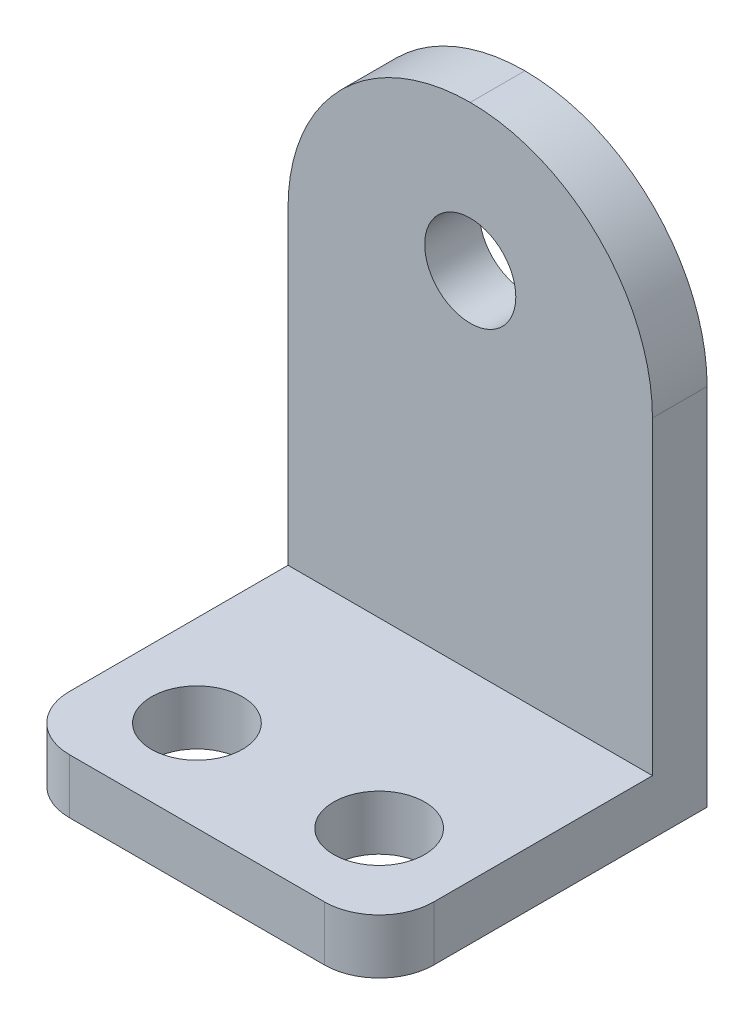
ISO-10303-21;
HEADER;
FILE_DESCRIPTION(('STEP AP214'),'2;1');
FILE_NAME('part.step','',(''),(''),'','','');
FILE_SCHEMA(('AUTOMOTIVE_DESIGN { 1 0 10303 214 1 1 1 1 }'));
ENDSEC;
DATA;
#1=APPLICATION_CONTEXT('core data for automotive mechanical design processes');
#2=APPLICATION_PROTOCOL_DEFINITION('international standard','automotive_design',2000,#1);
#3=PRODUCT_CONTEXT('',#1,'mechanical');
#4=PRODUCT('Part','Part','',(#3));
#5=PRODUCT_RELATED_PRODUCT_CATEGORY('part','',(#4));
#6=PRODUCT_DEFINITION_FORMATION('','',#4);
#7=PRODUCT_DEFINITION_CONTEXT('part definition',#1,'design');
#8=PRODUCT_DEFINITION('design','',#6,#7);
#9=PRODUCT_DEFINITION_SHAPE('','',#8);
#10=(LENGTH_UNIT() NAMED_UNIT(*) SI_UNIT(.MILLI.,.METRE.));
#11=(NAMED_UNIT(*) PLANE_ANGLE_UNIT() SI_UNIT($,.RADIAN.));
#12=(NAMED_UNIT(*) SI_UNIT($,.STERADIAN.) SOLID_ANGLE_UNIT());
#13=UNCERTAINTY_MEASURE_WITH_UNIT(LENGTH_MEASURE(1.E-05),#10,'distance_accuracy_value','');
#14=(GEOMETRIC_REPRESENTATION_CONTEXT(3) GLOBAL_UNCERTAINTY_ASSIGNED_CONTEXT((#13)) GLOBAL_UNIT_ASSIGNED_CONTEXT((#10,
#11,#12)) REPRESENTATION_CONTEXT('',''));
#15=CARTESIAN_POINT('',(0.,0.,0.));
#16=DIRECTION('',(0.,0.,1.));
#17=DIRECTION('',(1.,0.,0.));
#18=AXIS2_PLACEMENT_3D('',#15,#16,#17);
#19=CARTESIAN_POINT('',(20.,0.,18.));
#20=DIRECTION('',(0.,1.,0.));
#21=DIRECTION('',(0.,0.,1.));
#22=AXIS2_PLACEMENT_3D('',#19,#20,#21);
#23=PLANE('',#22);
#24=CARTESIAN_POINT('',(5.,0.,13.));
#25=DIRECTION('',(0.,1.,0.));
#26=DIRECTION('',(0.,0.,1.));
#27=AXIS2_PLACEMENT_3D('',#24,#25,#26);
#28=CIRCLE('',#27,2.5);
#29=CARTESIAN_POINT('',(5.,0.,15.5));
#30=VERTEX_POINT('',#29);
#31=EDGE_CURVE('E229',#30,#30,#28,.T.);
#32=ORIENTED_EDGE('',*,*,#31,.T.);
#33=EDGE_LOOP('',(#32));
#34=FACE_BOUND('',#33,.T.);
#35=CARTESIAN_POINT('',(15.,0.,13.));
#36=DIRECTION('',(0.,1.,0.));
#37=DIRECTION('',(0.,0.,1.));
#38=AXIS2_PLACEMENT_3D('',#35,#36,#37);
#39=CIRCLE('',#38,2.5);
#40=CARTESIAN_POINT('',(15.,0.,15.5));
#41=VERTEX_POINT('',#40);
#42=EDGE_CURVE('E233',#41,#41,#39,.T.);
#43=ORIENTED_EDGE('',*,*,#42,.T.);
#44=EDGE_LOOP('',(#43));
#45=FACE_BOUND('',#44,.T.);
#46=DIRECTION('',(-1.,0.,0.));
#47=VECTOR('',#46,1.);
#48=CARTESIAN_POINT('',(20.,0.,18.));
#49=LINE('',#48,#47);
#50=CARTESIAN_POINT('',(17.,0.,18.));
#51=VERTEX_POINT('',#50);
#52=CARTESIAN_POINT('',(3.,0.,18.));
#53=VERTEX_POINT('',#52);
#54=EDGE_CURVE('E198',#51,#53,#49,.T.);
#55=ORIENTED_EDGE('',*,*,#54,.T.);
#56=CARTESIAN_POINT('',(3.,0.,15.));
#57=DIRECTION('',(0.,1.,0.));
#58=DIRECTION('',(0.,0.,1.));
#59=AXIS2_PLACEMENT_3D('',#56,#57,#58);
#60=CIRCLE('',#59,3.);
#61=CARTESIAN_POINT('',(0.,0.,15.));
#62=VERTEX_POINT('',#61);
#63=EDGE_CURVE('E181',#53,#62,#60,.F.);
#64=ORIENTED_EDGE('',*,*,#63,.T.);
#65=DIRECTION('',(0.,0.,-1.));
#66=VECTOR('',#65,1.);
#67=CARTESIAN_POINT('',(0.,0.,18.));
#68=LINE('',#67,#66);
#69=CARTESIAN_POINT('',(0.,0.,0.));
#70=VERTEX_POINT('',#69);
#71=EDGE_CURVE('E137',#62,#70,#68,.T.);
#72=ORIENTED_EDGE('',*,*,#71,.T.);
#73=DIRECTION('',(-1.,0.,0.));
#74=VECTOR('',#73,1.);
#75=CARTESIAN_POINT('',(20.,0.,0.));
#76=LINE('',#75,#74);
#77=CARTESIAN_POINT('',(20.,0.,0.));
#78=VERTEX_POINT('',#77);
#79=EDGE_CURVE('E130',#78,#70,#76,.T.);
#80=ORIENTED_EDGE('',*,*,#79,.F.);
#81=DIRECTION('',(0.,0.,-1.));
#82=VECTOR('',#81,1.);
#83=CARTESIAN_POINT('',(20.,0.,18.));
#84=LINE('',#83,#82);
#85=CARTESIAN_POINT('',(20.,0.,15.));
#86=VERTEX_POINT('',#85);
#87=EDGE_CURVE('E115',#86,#78,#84,.T.);
#88=ORIENTED_EDGE('',*,*,#87,.F.);
#89=CARTESIAN_POINT('',(17.,0.,15.));
#90=DIRECTION('',(0.,1.,0.));
#91=DIRECTION('',(0.,0.,1.));
#92=AXIS2_PLACEMENT_3D('',#89,#90,#91);
#93=CIRCLE('',#92,3.);
#94=EDGE_CURVE('E178',#86,#51,#93,.F.);
#95=ORIENTED_EDGE('',*,*,#94,.T.);
#96=EDGE_LOOP('',(#55,#64,#72,#80,#88,#95));
#97=FACE_BOUND('',#96,.T.);
#98=ADVANCED_FACE('F39',(#34,#45,#97),#23,.F.);
#99=CARTESIAN_POINT('',(20.,0.,0.));
#100=DIRECTION('',(0.,0.,1.));
#101=DIRECTION('',(1.,0.,0.));
#102=AXIS2_PLACEMENT_3D('',#99,#100,#101);
#103=PLANE('',#102);
#104=CARTESIAN_POINT('',(10.,22.,0.));
#105=DIRECTION('',(0.,0.,1.));
#106=DIRECTION('',(1.,0.,0.));
#107=AXIS2_PLACEMENT_3D('',#104,#105,#106);
#108=CIRCLE('',#107,2.5);
#109=CARTESIAN_POINT('',(12.5,22.,0.));
#110=VERTEX_POINT('',#109);
#111=EDGE_CURVE('E203',#110,#110,#108,.T.);
#112=ORIENTED_EDGE('',*,*,#111,.T.);
#113=EDGE_LOOP('',(#112));
#114=FACE_BOUND('',#113,.T.);
#115=DIRECTION('',(0.,1.,0.));
#116=VECTOR('',#115,1.);
#117=CARTESIAN_POINT('',(0.,0.,0.));
#118=LINE('',#117,#116);
#119=CARTESIAN_POINT('',(0.,20.,0.));
#120=VERTEX_POINT('',#119);
#121=EDGE_CURVE('E201',#70,#120,#118,.T.);
#122=ORIENTED_EDGE('',*,*,#121,.T.);
#123=CARTESIAN_POINT('',(10.,20.,0.));
#124=DIRECTION('',(0.,0.,1.));
#125=DIRECTION('',(1.,0.,0.));
#126=AXIS2_PLACEMENT_3D('',#123,#124,#125);
#127=CIRCLE('',#126,10.);
#128=CARTESIAN_POINT('',(10.,30.,0.));
#129=VERTEX_POINT('',#128);
#130=EDGE_CURVE('E160',#120,#129,#127,.F.);
#131=ORIENTED_EDGE('',*,*,#130,.T.);
#132=CARTESIAN_POINT('',(10.,20.,0.));
#133=DIRECTION('',(0.,0.,1.));
#134=DIRECTION('',(1.,0.,0.));
#135=AXIS2_PLACEMENT_3D('',#132,#133,#134);
#136=CIRCLE('',#135,10.);
#137=CARTESIAN_POINT('',(20.,20.,0.));
#138=VERTEX_POINT('',#137);
#139=EDGE_CURVE('E132',#129,#138,#136,.F.);
#140=ORIENTED_EDGE('',*,*,#139,.T.);
#141=DIRECTION('',(0.,1.,0.));
#142=VECTOR('',#141,1.);
#143=CARTESIAN_POINT('',(20.,0.,0.));
#144=LINE('',#143,#142);
#145=EDGE_CURVE('E118',#78,#138,#144,.T.);
#146=ORIENTED_EDGE('',*,*,#145,.F.);
#147=ORIENTED_EDGE('',*,*,#79,.T.);
#148=EDGE_LOOP('',(#122,#131,#140,#146,#147));
#149=FACE_BOUND('',#148,.T.);
#150=ADVANCED_FACE('F129',(#114,#149),#103,.F.);
#151=CARTESIAN_POINT('',(20.,30.,3.));
#152=DIRECTION('',(0.,0.,-1.));
#153=DIRECTION('',(0.,1.,0.));
#154=AXIS2_PLACEMENT_3D('',#151,#152,#153);
#155=PLANE('',#154);
#156=CARTESIAN_POINT('',(10.,22.,3.));
#157=DIRECTION('',(0.,0.,1.));
#158=DIRECTION('',(1.,0.,0.));
#159=AXIS2_PLACEMENT_3D('',#156,#157,#158);
#160=CIRCLE('',#159,2.5);
#161=CARTESIAN_POINT('',(12.5,22.,3.));
#162=VERTEX_POINT('',#161);
#163=EDGE_CURVE('E210',#162,#162,#160,.T.);
#164=ORIENTED_EDGE('',*,*,#163,.F.);
#165=EDGE_LOOP('',(#164));
#166=FACE_BOUND('',#165,.T.);
#167=CARTESIAN_POINT('',(10.,20.,3.));
#168=DIRECTION('',(0.,0.,-1.));
#169=DIRECTION('',(0.,1.,0.));
#170=AXIS2_PLACEMENT_3D('',#167,#168,#169);
#171=CIRCLE('',#170,10.);
#172=CARTESIAN_POINT('',(20.,20.,3.));
#173=VERTEX_POINT('',#172);
#174=CARTESIAN_POINT('',(10.,30.,3.));
#175=VERTEX_POINT('',#174);
#176=EDGE_CURVE('E140',#173,#175,#171,.F.);
#177=ORIENTED_EDGE('',*,*,#176,.T.);
#178=CARTESIAN_POINT('',(10.,20.,3.));
#179=DIRECTION('',(0.,0.,-1.));
#180=DIRECTION('',(0.,1.,0.));
#181=AXIS2_PLACEMENT_3D('',#178,#179,#180);
#182=CIRCLE('',#181,10.);
#183=CARTESIAN_POINT('',(0.,20.,3.));
#184=VERTEX_POINT('',#183);
#185=EDGE_CURVE('E145',#175,#184,#182,.F.);
#186=ORIENTED_EDGE('',*,*,#185,.T.);
#187=DIRECTION('',(0.,-1.,0.));
#188=VECTOR('',#187,1.);
#189=CARTESIAN_POINT('',(0.,30.,3.));
#190=LINE('',#189,#188);
#191=CARTESIAN_POINT('',(0.,3.,3.));
#192=VERTEX_POINT('',#191);
#193=EDGE_CURVE('E207',#184,#192,#190,.T.);
#194=ORIENTED_EDGE('',*,*,#193,.T.);
#195=DIRECTION('',(-1.,0.,0.));
#196=VECTOR('',#195,1.);
#197=CARTESIAN_POINT('',(20.,3.,3.));
#198=LINE('',#197,#196);
#199=CARTESIAN_POINT('',(20.,3.,3.));
#200=VERTEX_POINT('',#199);
#201=EDGE_CURVE('E141',#200,#192,#198,.T.);
#202=ORIENTED_EDGE('',*,*,#201,.F.);
#203=DIRECTION('',(0.,-1.,0.));
#204=VECTOR('',#203,1.);
#205=CARTESIAN_POINT('',(20.,30.,3.));
#206=LINE('',#205,#204);
#207=EDGE_CURVE('E134',#173,#200,#206,.T.);
#208=ORIENTED_EDGE('',*,*,#207,.F.);
#209=EDGE_LOOP('',(#177,#186,#194,#202,#208));
#210=FACE_BOUND('',#209,.T.);
#211=ADVANCED_FACE('F250',(#166,#210),#155,.F.);
#212=CARTESIAN_POINT('',(20.,3.,3.));
#213=DIRECTION('',(0.,-1.,0.));
#214=DIRECTION('',(0.,0.,-1.));
#215=AXIS2_PLACEMENT_3D('',#212,#213,#214);
#216=PLANE('',#215);
#217=CARTESIAN_POINT('',(5.,3.,13.));
#218=DIRECTION('',(0.,1.,0.));
#219=DIRECTION('',(0.,0.,1.));
#220=AXIS2_PLACEMENT_3D('',#217,#218,#219);
#221=CIRCLE('',#220,2.5);
#222=CARTESIAN_POINT('',(5.,3.,15.5));
#223=VERTEX_POINT('',#222);
#224=EDGE_CURVE('E237',#223,#223,#221,.T.);
#225=ORIENTED_EDGE('',*,*,#224,.F.);
#226=EDGE_LOOP('',(#225));
#227=FACE_BOUND('',#226,.T.);
#228=CARTESIAN_POINT('',(15.,3.,13.));
#229=DIRECTION('',(0.,1.,0.));
#230=DIRECTION('',(0.,0.,1.));
#231=AXIS2_PLACEMENT_3D('',#228,#229,#230);
#232=CIRCLE('',#231,2.5);
#233=CARTESIAN_POINT('',(15.,3.,15.5));
#234=VERTEX_POINT('',#233);
#235=EDGE_CURVE('E171',#234,#234,#232,.T.);
#236=ORIENTED_EDGE('',*,*,#235,.F.);
#237=EDGE_LOOP('',(#236));
#238=FACE_BOUND('',#237,.T.);
#239=DIRECTION('',(0.,0.,1.));
#240=VECTOR('',#239,1.);
#241=CARTESIAN_POINT('',(0.,3.,3.));
#242=LINE('',#241,#240);
#243=CARTESIAN_POINT('',(0.,3.,15.));
#244=VERTEX_POINT('',#243);
#245=EDGE_CURVE('E124',#192,#244,#242,.T.);
#246=ORIENTED_EDGE('',*,*,#245,.T.);
#247=CARTESIAN_POINT('',(3.,3.,15.));
#248=DIRECTION('',(0.,-1.,0.));
#249=DIRECTION('',(0.,0.,-1.));
#250=AXIS2_PLACEMENT_3D('',#247,#248,#249);
#251=CIRCLE('',#250,3.);
#252=CARTESIAN_POINT('',(3.,3.,18.));
#253=VERTEX_POINT('',#252);
#254=EDGE_CURVE('E48',#244,#253,#251,.F.);
#255=ORIENTED_EDGE('',*,*,#254,.T.);
#256=DIRECTION('',(-1.,0.,0.));
#257=VECTOR('',#256,1.);
#258=CARTESIAN_POINT('',(20.,3.,18.));
#259=LINE('',#258,#257);
#260=CARTESIAN_POINT('',(17.,3.,18.));
#261=VERTEX_POINT('',#260);
#262=EDGE_CURVE('E148',#261,#253,#259,.T.);
#263=ORIENTED_EDGE('',*,*,#262,.F.);
#264=CARTESIAN_POINT('',(17.,3.,15.));
#265=DIRECTION('',(0.,-1.,0.));
#266=DIRECTION('',(0.,0.,-1.));
#267=AXIS2_PLACEMENT_3D('',#264,#265,#266);
#268=CIRCLE('',#267,3.);
#269=CARTESIAN_POINT('',(20.,3.,15.));
#270=VERTEX_POINT('',#269);
#271=EDGE_CURVE('E55',#261,#270,#268,.F.);
#272=ORIENTED_EDGE('',*,*,#271,.T.);
#273=DIRECTION('',(0.,0.,1.));
#274=VECTOR('',#273,1.);
#275=CARTESIAN_POINT('',(20.,3.,3.));
#276=LINE('',#275,#274);
#277=EDGE_CURVE('E213',#200,#270,#276,.T.);
#278=ORIENTED_EDGE('',*,*,#277,.F.);
#279=ORIENTED_EDGE('',*,*,#201,.T.);
#280=EDGE_LOOP('',(#246,#255,#263,#272,#278,#279));
#281=FACE_BOUND('',#280,.T.);
#282=ADVANCED_FACE('F190',(#227,#238,#281),#216,.F.);
#283=CARTESIAN_POINT('',(20.,3.,18.));
#284=DIRECTION('',(0.,0.,-1.));
#285=DIRECTION('',(-1.,0.,0.));
#286=AXIS2_PLACEMENT_3D('',#283,#284,#285);
#287=PLANE('',#286);
#288=ORIENTED_EDGE('',*,*,#262,.T.);
#289=DIRECTION('',(0.,-1.,0.));
#290=VECTOR('',#289,1.);
#291=CARTESIAN_POINT('',(3.,3.,18.));
#292=LINE('',#291,#290);
#293=EDGE_CURVE('E174',#253,#53,#292,.T.);
#294=ORIENTED_EDGE('',*,*,#293,.T.);
#295=ORIENTED_EDGE('',*,*,#54,.F.);
#296=DIRECTION('',(0.,-1.,0.));
#297=VECTOR('',#296,1.);
#298=CARTESIAN_POINT('',(17.,3.,18.));
#299=LINE('',#298,#297);
#300=EDGE_CURVE('E166',#51,#261,#299,.F.);
#301=ORIENTED_EDGE('',*,*,#300,.T.);
#302=EDGE_LOOP('',(#288,#294,#295,#301));
#303=FACE_BOUND('',#302,.T.);
#304=ADVANCED_FACE('F194',(#303),#287,.F.);
#305=CARTESIAN_POINT('',(20.,0.,0.));
#306=DIRECTION('',(1.,0.,0.));
#307=DIRECTION('',(0.,0.,-1.));
#308=AXIS2_PLACEMENT_3D('',#305,#306,#307);
#309=PLANE('',#308);
#310=ORIENTED_EDGE('',*,*,#277,.T.);
#311=DIRECTION('',(0.,-1.,0.));
#312=VECTOR('',#311,1.);
#313=CARTESIAN_POINT('',(20.,0.,15.));
#314=LINE('',#313,#312);
#315=EDGE_CURVE('E11',#270,#86,#314,.T.);
#316=ORIENTED_EDGE('',*,*,#315,.T.);
#317=ORIENTED_EDGE('',*,*,#87,.T.);
#318=ORIENTED_EDGE('',*,*,#145,.T.);
#319=DIRECTION('',(0.,0.,1.));
#320=VECTOR('',#319,1.);
#321=CARTESIAN_POINT('',(20.,20.,3.));
#322=LINE('',#321,#320);
#323=EDGE_CURVE('E163',#138,#173,#322,.T.);
#324=ORIENTED_EDGE('',*,*,#323,.T.);
#325=ORIENTED_EDGE('',*,*,#207,.T.);
#326=EDGE_LOOP('',(#310,#316,#317,#318,#324,#325));
#327=FACE_BOUND('',#326,.T.);
#328=ADVANCED_FACE('F117',(#327),#309,.T.);
#329=CARTESIAN_POINT('',(0.,0.,0.));
#330=DIRECTION('',(1.,0.,0.));
#331=DIRECTION('',(0.,0.,-1.));
#332=AXIS2_PLACEMENT_3D('',#329,#330,#331);
#333=PLANE('',#332);
#334=ORIENTED_EDGE('',*,*,#71,.F.);
#335=DIRECTION('',(0.,-1.,0.));
#336=VECTOR('',#335,1.);
#337=CARTESIAN_POINT('',(0.,0.,15.));
#338=LINE('',#337,#336);
#339=EDGE_CURVE('E63',#62,#244,#338,.F.);
#340=ORIENTED_EDGE('',*,*,#339,.T.);
#341=ORIENTED_EDGE('',*,*,#245,.F.);
#342=ORIENTED_EDGE('',*,*,#193,.F.);
#343=DIRECTION('',(0.,0.,1.));
#344=VECTOR('',#343,1.);
#345=CARTESIAN_POINT('',(0.,20.,0.));
#346=LINE('',#345,#344);
#347=EDGE_CURVE('E154',#184,#120,#346,.F.);
#348=ORIENTED_EDGE('',*,*,#347,.T.);
#349=ORIENTED_EDGE('',*,*,#121,.F.);
#350=EDGE_LOOP('',(#334,#340,#341,#342,#348,#349));
#351=FACE_BOUND('',#350,.T.);
#352=ADVANCED_FACE('F200',(#351),#333,.F.);
#353=CARTESIAN_POINT('',(10.,22.,-17.));
#354=DIRECTION('',(0.,0.,1.));
#355=DIRECTION('',(1.,0.,0.));
#356=AXIS2_PLACEMENT_3D('',#353,#354,#355);
#357=CYLINDRICAL_SURFACE('',#356,2.5);
#358=ORIENTED_EDGE('',*,*,#163,.T.);
#359=EDGE_LOOP('',(#358));
#360=FACE_BOUND('',#359,.T.);
#361=ORIENTED_EDGE('',*,*,#111,.F.);
#362=EDGE_LOOP('',(#361));
#363=FACE_BOUND('',#362,.T.);
#364=ADVANCED_FACE('F257',(#360,#363),#357,.F.);
#365=CARTESIAN_POINT('',(15.,-17.,13.));
#366=DIRECTION('',(0.,1.,0.));
#367=DIRECTION('',(0.,0.,1.));
#368=AXIS2_PLACEMENT_3D('',#365,#366,#367);
#369=CYLINDRICAL_SURFACE('',#368,2.5);
#370=ORIENTED_EDGE('',*,*,#235,.T.);
#371=EDGE_LOOP('',(#370));
#372=FACE_BOUND('',#371,.T.);
#373=ORIENTED_EDGE('',*,*,#42,.F.);
#374=EDGE_LOOP('',(#373));
#375=FACE_BOUND('',#374,.T.);
#376=ADVANCED_FACE('F254',(#372,#375),#369,.F.);
#377=CARTESIAN_POINT('',(5.,-17.,13.));
#378=DIRECTION('',(0.,1.,0.));
#379=DIRECTION('',(0.,0.,1.));
#380=AXIS2_PLACEMENT_3D('',#377,#378,#379);
#381=CYLINDRICAL_SURFACE('',#380,2.5);
#382=ORIENTED_EDGE('',*,*,#224,.T.);
#383=EDGE_LOOP('',(#382));
#384=FACE_BOUND('',#383,.T.);
#385=ORIENTED_EDGE('',*,*,#31,.F.);
#386=EDGE_LOOP('',(#385));
#387=FACE_BOUND('',#386,.T.);
#388=ADVANCED_FACE('F245',(#384,#387),#381,.F.);
#389=CARTESIAN_POINT('',(10.,20.,0.));
#390=DIRECTION('',(0.,0.,-1.));
#391=DIRECTION('',(-1.,0.,0.));
#392=AXIS2_PLACEMENT_3D('',#389,#390,#391);
#393=CYLINDRICAL_SURFACE('',#392,10.);
#394=ORIENTED_EDGE('',*,*,#323,.F.);
#395=ORIENTED_EDGE('',*,*,#139,.F.);
#396=DIRECTION('',(0.,0.,1.));
#397=VECTOR('',#396,1.);
#398=CARTESIAN_POINT('',(10.,30.,0.));
#399=LINE('',#398,#397);
#400=EDGE_CURVE('E167',#175,#129,#399,.F.);
#401=ORIENTED_EDGE('',*,*,#400,.F.);
#402=ORIENTED_EDGE('',*,*,#176,.F.);
#403=EDGE_LOOP('',(#394,#395,#401,#402));
#404=FACE_BOUND('',#403,.T.);
#405=ADVANCED_FACE('F274',(#404),#393,.T.);
#406=CARTESIAN_POINT('',(10.,20.,0.));
#407=DIRECTION('',(0.,0.,1.));
#408=DIRECTION('',(1.,0.,0.));
#409=AXIS2_PLACEMENT_3D('',#406,#407,#408);
#410=CYLINDRICAL_SURFACE('',#409,10.);
#411=ORIENTED_EDGE('',*,*,#130,.F.);
#412=ORIENTED_EDGE('',*,*,#347,.F.);
#413=ORIENTED_EDGE('',*,*,#185,.F.);
#414=ORIENTED_EDGE('',*,*,#400,.T.);
#415=EDGE_LOOP('',(#411,#412,#413,#414));
#416=FACE_BOUND('',#415,.T.);
#417=ADVANCED_FACE('F271',(#416),#410,.T.);
#418=CARTESIAN_POINT('',(3.,3.,15.));
#419=DIRECTION('',(0.,-1.,0.));
#420=DIRECTION('',(0.,0.,-1.));
#421=AXIS2_PLACEMENT_3D('',#418,#419,#420);
#422=CYLINDRICAL_SURFACE('',#421,3.);
#423=ORIENTED_EDGE('',*,*,#254,.F.);
#424=ORIENTED_EDGE('',*,*,#339,.F.);
#425=ORIENTED_EDGE('',*,*,#63,.F.);
#426=ORIENTED_EDGE('',*,*,#293,.F.);
#427=EDGE_LOOP('',(#423,#424,#425,#426));
#428=FACE_BOUND('',#427,.T.);
#429=ADVANCED_FACE('F199',(#428),#422,.T.);
#430=CARTESIAN_POINT('',(17.,0.,15.));
#431=DIRECTION('',(0.,1.,0.));
#432=DIRECTION('',(0.,0.,1.));
#433=AXIS2_PLACEMENT_3D('',#430,#431,#432);
#434=CYLINDRICAL_SURFACE('',#433,3.);
#435=ORIENTED_EDGE('',*,*,#271,.F.);
#436=ORIENTED_EDGE('',*,*,#300,.F.);
#437=ORIENTED_EDGE('',*,*,#94,.F.);
#438=ORIENTED_EDGE('',*,*,#315,.F.);
#439=EDGE_LOOP('',(#435,#436,#437,#438));
#440=FACE_BOUND('',#439,.T.);
#441=ADVANCED_FACE('F41',(#440),#434,.T.);
#442=CLOSED_SHELL('',(#98,#150,#211,#282,#304,#328,#352,#364,#376,#388,#405,#417,#429,#441));
#443=MANIFOLD_SOLID_BREP('B2',#442);
#444=ADVANCED_BREP_SHAPE_REPRESENTATION('',(#18,#443),#14);
#445=SHAPE_DEFINITION_REPRESENTATION(#9,#444);
ENDSEC;
END-ISO-10303-21;
